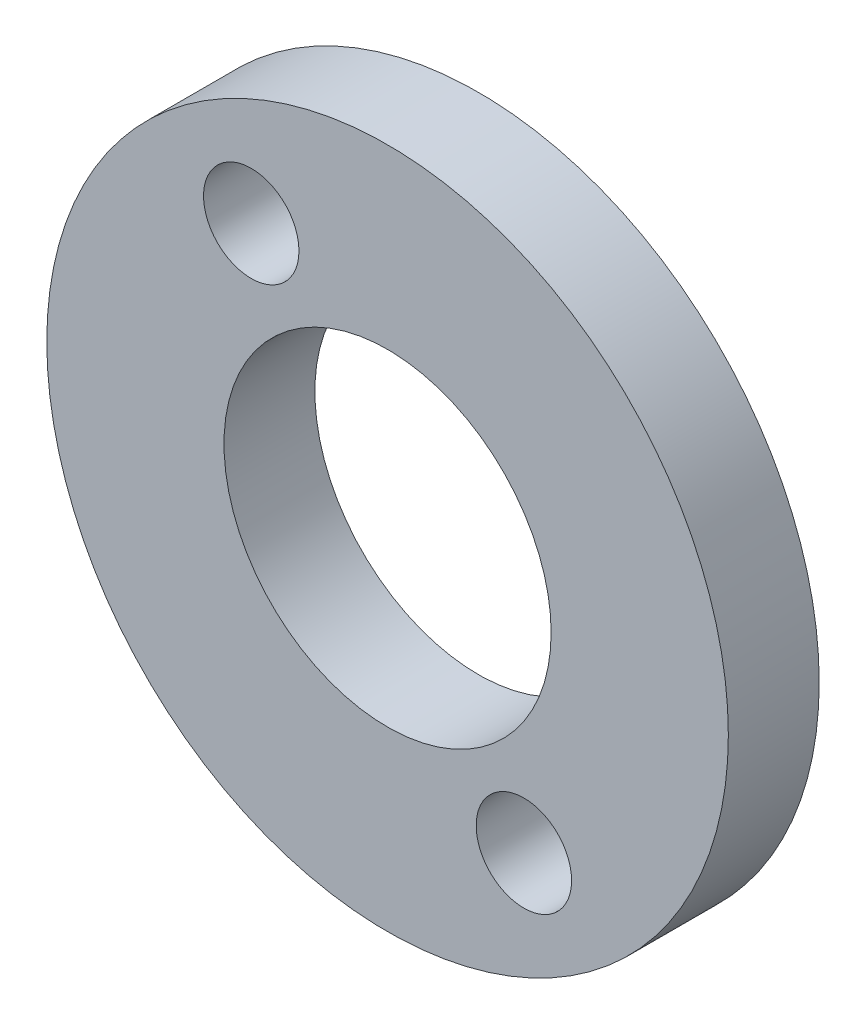
ISO-10303-21;
HEADER;
FILE_DESCRIPTION(('STEP AP214'),'2;1');
FILE_NAME('part.step','',(''),(''),'','','');
FILE_SCHEMA(('AUTOMOTIVE_DESIGN { 1 0 10303 214 1 1 1 1 }'));
ENDSEC;
DATA;
#1=APPLICATION_CONTEXT('core data for automotive mechanical design processes');
#2=APPLICATION_PROTOCOL_DEFINITION('international standard','automotive_design',2000,#1);
#3=PRODUCT_CONTEXT('',#1,'mechanical');
#4=PRODUCT('Part','Part','',(#3));
#5=PRODUCT_RELATED_PRODUCT_CATEGORY('part','',(#4));
#6=PRODUCT_DEFINITION_FORMATION('','',#4);
#7=PRODUCT_DEFINITION_CONTEXT('part definition',#1,'design');
#8=PRODUCT_DEFINITION('design','',#6,#7);
#9=PRODUCT_DEFINITION_SHAPE('','',#8);
#10=(LENGTH_UNIT() NAMED_UNIT(*) SI_UNIT(.MILLI.,.METRE.));
#11=(NAMED_UNIT(*) PLANE_ANGLE_UNIT() SI_UNIT($,.RADIAN.));
#12=(NAMED_UNIT(*) SI_UNIT($,.STERADIAN.) SOLID_ANGLE_UNIT());
#13=UNCERTAINTY_MEASURE_WITH_UNIT(LENGTH_MEASURE(1.E-05),#10,'distance_accuracy_value','');
#14=(GEOMETRIC_REPRESENTATION_CONTEXT(3) GLOBAL_UNCERTAINTY_ASSIGNED_CONTEXT((#13)) GLOBAL_UNIT_ASSIGNED_CONTEXT((#10,
#11,#12)) REPRESENTATION_CONTEXT('',''));
#15=CARTESIAN_POINT('',(0.,0.,0.));
#16=DIRECTION('',(0.,0.,1.));
#17=DIRECTION('',(1.,0.,0.));
#18=AXIS2_PLACEMENT_3D('',#15,#16,#17);
#19=CARTESIAN_POINT('',(0.,0.,2.));
#20=DIRECTION('',(0.,0.,1.));
#21=DIRECTION('',(1.,0.,0.));
#22=AXIS2_PLACEMENT_3D('',#19,#20,#21);
#23=PLANE('',#22);
#24=CARTESIAN_POINT('',(3.,-4.5,2.));
#25=DIRECTION('',(0.,0.,1.));
#26=DIRECTION('',(1.,0.,0.));
#27=AXIS2_PLACEMENT_3D('',#24,#25,#26);
#28=CIRCLE('',#27,1.05);
#29=CARTESIAN_POINT('',(4.05,-4.5,2.));
#30=VERTEX_POINT('',#29);
#31=EDGE_CURVE('E49',#30,#30,#28,.T.);
#32=ORIENTED_EDGE('',*,*,#31,.F.);
#33=EDGE_LOOP('',(#32));
#34=FACE_BOUND('',#33,.T.);
#35=CARTESIAN_POINT('',(0.,0.,2.));
#36=DIRECTION('',(0.,0.,1.));
#37=DIRECTION('',(1.,0.,0.));
#38=AXIS2_PLACEMENT_3D('',#35,#36,#37);
#39=CIRCLE('',#38,7.5);
#40=CARTESIAN_POINT('',(7.5,0.,2.));
#41=VERTEX_POINT('',#40);
#42=EDGE_CURVE('E10',#41,#41,#39,.T.);
#43=ORIENTED_EDGE('',*,*,#42,.T.);
#44=EDGE_LOOP('',(#43));
#45=FACE_BOUND('',#44,.T.);
#46=CARTESIAN_POINT('',(-3.,4.5,2.));
#47=DIRECTION('',(0.,0.,1.));
#48=DIRECTION('',(1.,0.,0.));
#49=AXIS2_PLACEMENT_3D('',#46,#47,#48);
#50=CIRCLE('',#49,1.05);
#51=CARTESIAN_POINT('',(-1.95,4.5,2.));
#52=VERTEX_POINT('',#51);
#53=EDGE_CURVE('E44',#52,#52,#50,.T.);
#54=ORIENTED_EDGE('',*,*,#53,.F.);
#55=EDGE_LOOP('',(#54));
#56=FACE_BOUND('',#55,.T.);
#57=CARTESIAN_POINT('',(0.,0.,2.));
#58=DIRECTION('',(0.,0.,1.));
#59=DIRECTION('',(1.,0.,0.));
#60=AXIS2_PLACEMENT_3D('',#57,#58,#59);
#61=CIRCLE('',#60,3.6);
#62=CARTESIAN_POINT('',(3.6,0.,2.));
#63=VERTEX_POINT('',#62);
#64=EDGE_CURVE('E55',#63,#63,#61,.T.);
#65=ORIENTED_EDGE('',*,*,#64,.F.);
#66=EDGE_LOOP('',(#65));
#67=FACE_BOUND('',#66,.T.);
#68=ADVANCED_FACE('F33',(#34,#45,#56,#67),#23,.T.);
#69=CARTESIAN_POINT('',(0.,0.,0.));
#70=DIRECTION('',(0.,0.,1.));
#71=DIRECTION('',(1.,0.,0.));
#72=AXIS2_PLACEMENT_3D('',#69,#70,#71);
#73=PLANE('',#72);
#74=CARTESIAN_POINT('',(0.,0.,0.));
#75=DIRECTION('',(0.,0.,1.));
#76=DIRECTION('',(1.,0.,0.));
#77=AXIS2_PLACEMENT_3D('',#74,#75,#76);
#78=CIRCLE('',#77,7.5);
#79=CARTESIAN_POINT('',(7.5,0.,0.));
#80=VERTEX_POINT('',#79);
#81=EDGE_CURVE('E37',#80,#80,#78,.T.);
#82=ORIENTED_EDGE('',*,*,#81,.F.);
#83=EDGE_LOOP('',(#82));
#84=FACE_BOUND('',#83,.T.);
#85=CARTESIAN_POINT('',(-3.,4.5,0.));
#86=DIRECTION('',(0.,0.,1.));
#87=DIRECTION('',(1.,0.,0.));
#88=AXIS2_PLACEMENT_3D('',#85,#86,#87);
#89=CIRCLE('',#88,1.05);
#90=CARTESIAN_POINT('',(-1.95,4.5,0.));
#91=VERTEX_POINT('',#90);
#92=EDGE_CURVE('E46',#91,#91,#89,.T.);
#93=ORIENTED_EDGE('',*,*,#92,.T.);
#94=EDGE_LOOP('',(#93));
#95=FACE_BOUND('',#94,.T.);
#96=CARTESIAN_POINT('',(3.,-4.5,0.));
#97=DIRECTION('',(0.,0.,1.));
#98=DIRECTION('',(1.,0.,0.));
#99=AXIS2_PLACEMENT_3D('',#96,#97,#98);
#100=CIRCLE('',#99,1.05);
#101=CARTESIAN_POINT('',(4.05,-4.5,0.));
#102=VERTEX_POINT('',#101);
#103=EDGE_CURVE('E52',#102,#102,#100,.T.);
#104=ORIENTED_EDGE('',*,*,#103,.T.);
#105=EDGE_LOOP('',(#104));
#106=FACE_BOUND('',#105,.T.);
#107=CARTESIAN_POINT('',(0.,0.,0.));
#108=DIRECTION('',(0.,0.,1.));
#109=DIRECTION('',(1.,0.,0.));
#110=AXIS2_PLACEMENT_3D('',#107,#108,#109);
#111=CIRCLE('',#110,3.6);
#112=CARTESIAN_POINT('',(3.6,0.,0.));
#113=VERTEX_POINT('',#112);
#114=EDGE_CURVE('E58',#113,#113,#111,.T.);
#115=ORIENTED_EDGE('',*,*,#114,.T.);
#116=EDGE_LOOP('',(#115));
#117=FACE_BOUND('',#116,.T.);
#118=ADVANCED_FACE('F68',(#84,#95,#106,#117),#73,.F.);
#119=CARTESIAN_POINT('',(0.,0.,2.));
#120=DIRECTION('',(0.,0.,-1.));
#121=DIRECTION('',(-1.,0.,0.));
#122=AXIS2_PLACEMENT_3D('',#119,#120,#121);
#123=CYLINDRICAL_SURFACE('',#122,7.5);
#124=ORIENTED_EDGE('',*,*,#42,.F.);
#125=EDGE_LOOP('',(#124));
#126=FACE_BOUND('',#125,.T.);
#127=ORIENTED_EDGE('',*,*,#81,.T.);
#128=EDGE_LOOP('',(#127));
#129=FACE_BOUND('',#128,.T.);
#130=ADVANCED_FACE('F35',(#126,#129),#123,.T.);
#131=CARTESIAN_POINT('',(-3.,4.5,2.));
#132=DIRECTION('',(0.,0.,-1.));
#133=DIRECTION('',(-1.,0.,0.));
#134=AXIS2_PLACEMENT_3D('',#131,#132,#133);
#135=CYLINDRICAL_SURFACE('',#134,1.05);
#136=ORIENTED_EDGE('',*,*,#53,.T.);
#137=EDGE_LOOP('',(#136));
#138=FACE_BOUND('',#137,.T.);
#139=ORIENTED_EDGE('',*,*,#92,.F.);
#140=EDGE_LOOP('',(#139));
#141=FACE_BOUND('',#140,.T.);
#142=ADVANCED_FACE('F77',(#138,#141),#135,.F.);
#143=CARTESIAN_POINT('',(3.,-4.5,2.));
#144=DIRECTION('',(0.,0.,-1.));
#145=DIRECTION('',(-1.,0.,0.));
#146=AXIS2_PLACEMENT_3D('',#143,#144,#145);
#147=CYLINDRICAL_SURFACE('',#146,1.05);
#148=ORIENTED_EDGE('',*,*,#31,.T.);
#149=EDGE_LOOP('',(#148));
#150=FACE_BOUND('',#149,.T.);
#151=ORIENTED_EDGE('',*,*,#103,.F.);
#152=EDGE_LOOP('',(#151));
#153=FACE_BOUND('',#152,.T.);
#154=ADVANCED_FACE('F80',(#150,#153),#147,.F.);
#155=CARTESIAN_POINT('',(0.,0.,2.));
#156=DIRECTION('',(0.,0.,-1.));
#157=DIRECTION('',(-1.,0.,0.));
#158=AXIS2_PLACEMENT_3D('',#155,#156,#157);
#159=CYLINDRICAL_SURFACE('',#158,3.6);
#160=ORIENTED_EDGE('',*,*,#64,.T.);
#161=EDGE_LOOP('',(#160));
#162=FACE_BOUND('',#161,.T.);
#163=ORIENTED_EDGE('',*,*,#114,.F.);
#164=EDGE_LOOP('',(#163));
#165=FACE_BOUND('',#164,.T.);
#166=ADVANCED_FACE('F64',(#162,#165),#159,.F.);
#167=CLOSED_SHELL('',(#68,#118,#130,#142,#154,#166));
#168=MANIFOLD_SOLID_BREP('B2',#167);
#169=ADVANCED_BREP_SHAPE_REPRESENTATION('',(#18,#168),#14);
#170=SHAPE_DEFINITION_REPRESENTATION(#9,#169);
ENDSEC;
END-ISO-10303-21;
